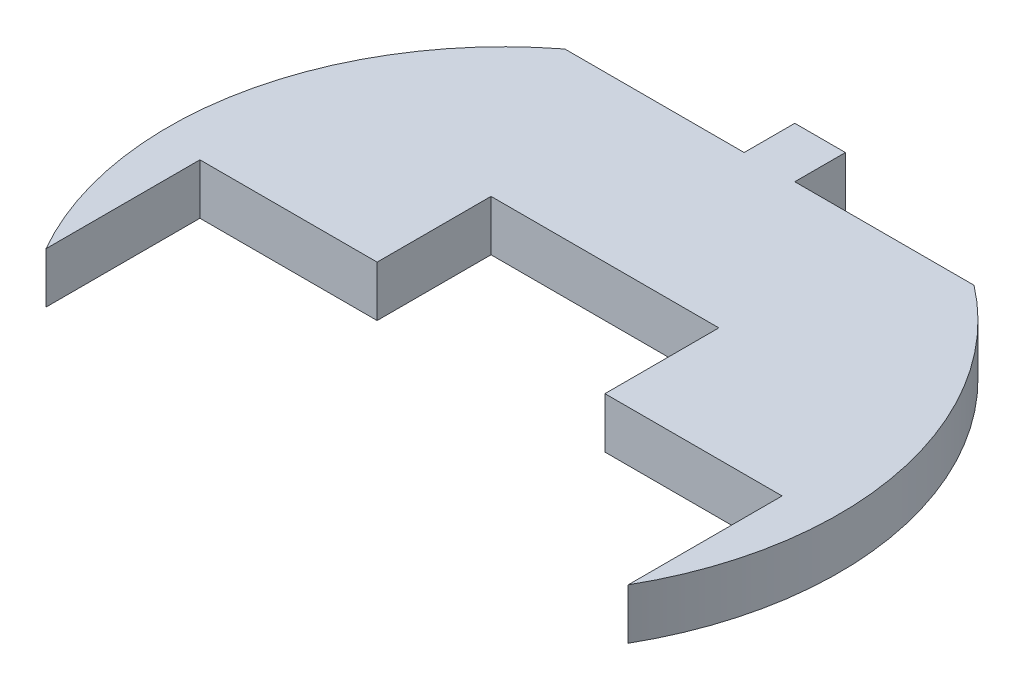
ISO-10303-21;
HEADER;
FILE_DESCRIPTION(('STEP AP214'),'2;1');
FILE_NAME('part.step','',(''),(''),'','','');
FILE_SCHEMA(('AUTOMOTIVE_DESIGN { 1 0 10303 214 1 1 1 1 }'));
ENDSEC;
DATA;
#1=APPLICATION_CONTEXT('core data for automotive mechanical design processes');
#2=APPLICATION_PROTOCOL_DEFINITION('international standard','automotive_design',2000,#1);
#3=PRODUCT_CONTEXT('',#1,'mechanical');
#4=PRODUCT('Part','Part','',(#3));
#5=PRODUCT_RELATED_PRODUCT_CATEGORY('part','',(#4));
#6=PRODUCT_DEFINITION_FORMATION('','',#4);
#7=PRODUCT_DEFINITION_CONTEXT('part definition',#1,'design');
#8=PRODUCT_DEFINITION('design','',#6,#7);
#9=PRODUCT_DEFINITION_SHAPE('','',#8);
#10=(LENGTH_UNIT() NAMED_UNIT(*) SI_UNIT(.MILLI.,.METRE.));
#11=(NAMED_UNIT(*) PLANE_ANGLE_UNIT() SI_UNIT($,.RADIAN.));
#12=(NAMED_UNIT(*) SI_UNIT($,.STERADIAN.) SOLID_ANGLE_UNIT());
#13=UNCERTAINTY_MEASURE_WITH_UNIT(LENGTH_MEASURE(1.E-05),#10,'distance_accuracy_value','');
#14=(GEOMETRIC_REPRESENTATION_CONTEXT(3) GLOBAL_UNCERTAINTY_ASSIGNED_CONTEXT((#13)) GLOBAL_UNIT_ASSIGNED_CONTEXT((#10,
#11,#12)) REPRESENTATION_CONTEXT('',''));
#15=CARTESIAN_POINT('',(0.,0.,0.));
#16=DIRECTION('',(0.,0.,1.));
#17=DIRECTION('',(1.,0.,0.));
#18=AXIS2_PLACEMENT_3D('',#15,#16,#17);
#19=CARTESIAN_POINT('',(0.,4.,5.));
#20=DIRECTION('',(0.,-1.,0.));
#21=DIRECTION('',(0.,0.,-1.));
#22=AXIS2_PLACEMENT_3D('',#19,#20,#21);
#23=CYLINDRICAL_SURFACE('',#22,26.5);
#24=CARTESIAN_POINT('',(0.,0.,5.));
#25=DIRECTION('',(0.,1.,0.));
#26=DIRECTION('',(0.,0.,1.));
#27=AXIS2_PLACEMENT_3D('',#24,#25,#26);
#28=CIRCLE('',#27,26.5);
#29=CARTESIAN_POINT('',(-23.,0.,18.1624465810882));
#30=VERTEX_POINT('',#29);
#31=CARTESIAN_POINT('',(-16.1632298752446,0.,-16.));
#32=VERTEX_POINT('',#31);
#33=EDGE_CURVE('E166',#30,#32,#28,.F.);
#34=ORIENTED_EDGE('',*,*,#33,.F.);
#35=DIRECTION('',(0.,-1.,0.));
#36=VECTOR('',#35,1.);
#37=CARTESIAN_POINT('',(-23.,4.,18.1624465810882));
#38=LINE('',#37,#36);
#39=CARTESIAN_POINT('',(-23.,4.,18.1624465810882));
#40=VERTEX_POINT('',#39);
#41=EDGE_CURVE('E11',#40,#30,#38,.T.);
#42=ORIENTED_EDGE('',*,*,#41,.F.);
#43=CARTESIAN_POINT('',(0.,4.,5.));
#44=DIRECTION('',(0.,1.,0.));
#45=DIRECTION('',(0.,0.,1.));
#46=AXIS2_PLACEMENT_3D('',#43,#44,#45);
#47=CIRCLE('',#46,26.5);
#48=CARTESIAN_POINT('',(-16.1632298752446,4.,-16.));
#49=VERTEX_POINT('',#48);
#50=EDGE_CURVE('E259',#40,#49,#47,.F.);
#51=ORIENTED_EDGE('',*,*,#50,.T.);
#52=DIRECTION('',(0.,-1.,0.));
#53=VECTOR('',#52,1.);
#54=CARTESIAN_POINT('',(-16.1632298752446,4.,-16.));
#55=LINE('',#54,#53);
#56=EDGE_CURVE('E51',#49,#32,#55,.T.);
#57=ORIENTED_EDGE('',*,*,#56,.T.);
#58=EDGE_LOOP('',(#34,#42,#51,#57));
#59=FACE_BOUND('',#58,.T.);
#60=ADVANCED_FACE('F34',(#59),#23,.T.);
#61=CARTESIAN_POINT('',(-23.,4.,0.));
#62=DIRECTION('',(-1.,0.,0.));
#63=DIRECTION('',(0.,0.,1.));
#64=AXIS2_PLACEMENT_3D('',#61,#62,#63);
#65=PLANE('',#64);
#66=DIRECTION('',(0.,0.,-1.));
#67=VECTOR('',#66,1.);
#68=CARTESIAN_POINT('',(-23.,0.,0.));
#69=LINE('',#68,#67);
#70=CARTESIAN_POINT('',(-23.,0.,6.));
#71=VERTEX_POINT('',#70);
#72=EDGE_CURVE('E168',#30,#71,#69,.T.);
#73=ORIENTED_EDGE('',*,*,#72,.T.);
#74=DIRECTION('',(0.,-1.,0.));
#75=VECTOR('',#74,1.);
#76=CARTESIAN_POINT('',(-23.,4.,6.));
#77=LINE('',#76,#75);
#78=CARTESIAN_POINT('',(-23.,4.,6.));
#79=VERTEX_POINT('',#78);
#80=EDGE_CURVE('E43',#79,#71,#77,.T.);
#81=ORIENTED_EDGE('',*,*,#80,.F.);
#82=DIRECTION('',(0.,0.,-1.));
#83=VECTOR('',#82,1.);
#84=CARTESIAN_POINT('',(-23.,4.,0.));
#85=LINE('',#84,#83);
#86=EDGE_CURVE('E260',#40,#79,#85,.T.);
#87=ORIENTED_EDGE('',*,*,#86,.F.);
#88=ORIENTED_EDGE('',*,*,#41,.T.);
#89=EDGE_LOOP('',(#73,#81,#87,#88));
#90=FACE_BOUND('',#89,.T.);
#91=ADVANCED_FACE('F36',(#90),#65,.F.);
#92=CARTESIAN_POINT('',(0.,4.,6.));
#93=DIRECTION('',(0.,0.,-1.));
#94=DIRECTION('',(-1.,0.,0.));
#95=AXIS2_PLACEMENT_3D('',#92,#93,#94);
#96=PLANE('',#95);
#97=DIRECTION('',(1.,0.,0.));
#98=VECTOR('',#97,1.);
#99=CARTESIAN_POINT('',(0.,0.,6.));
#100=LINE('',#99,#98);
#101=CARTESIAN_POINT('',(-9.,0.,6.));
#102=VERTEX_POINT('',#101);
#103=EDGE_CURVE('E171',#71,#102,#100,.T.);
#104=ORIENTED_EDGE('',*,*,#103,.T.);
#105=DIRECTION('',(0.,-1.,0.));
#106=VECTOR('',#105,1.);
#107=CARTESIAN_POINT('',(-9.,4.,6.));
#108=LINE('',#107,#106);
#109=CARTESIAN_POINT('',(-9.,4.,6.));
#110=VERTEX_POINT('',#109);
#111=EDGE_CURVE('E215',#110,#102,#108,.T.);
#112=ORIENTED_EDGE('',*,*,#111,.F.);
#113=DIRECTION('',(1.,0.,0.));
#114=VECTOR('',#113,1.);
#115=CARTESIAN_POINT('',(0.,4.,6.));
#116=LINE('',#115,#114);
#117=EDGE_CURVE('E224',#79,#110,#116,.T.);
#118=ORIENTED_EDGE('',*,*,#117,.F.);
#119=ORIENTED_EDGE('',*,*,#80,.T.);
#120=EDGE_LOOP('',(#104,#112,#118,#119));
#121=FACE_BOUND('',#120,.T.);
#122=ADVANCED_FACE('F222',(#121),#96,.F.);
#123=CARTESIAN_POINT('',(-9.,4.,0.));
#124=DIRECTION('',(-1.,0.,0.));
#125=DIRECTION('',(0.,0.,1.));
#126=AXIS2_PLACEMENT_3D('',#123,#124,#125);
#127=PLANE('',#126);
#128=DIRECTION('',(0.,0.,-1.));
#129=VECTOR('',#128,1.);
#130=CARTESIAN_POINT('',(-9.,0.,0.));
#131=LINE('',#130,#129);
#132=CARTESIAN_POINT('',(-9.,0.,-3.));
#133=VERTEX_POINT('',#132);
#134=EDGE_CURVE('E173',#102,#133,#131,.T.);
#135=ORIENTED_EDGE('',*,*,#134,.T.);
#136=DIRECTION('',(0.,-1.,0.));
#137=VECTOR('',#136,1.);
#138=CARTESIAN_POINT('',(-9.,4.,-3.));
#139=LINE('',#138,#137);
#140=CARTESIAN_POINT('',(-9.,4.,-3.));
#141=VERTEX_POINT('',#140);
#142=EDGE_CURVE('E212',#141,#133,#139,.T.);
#143=ORIENTED_EDGE('',*,*,#142,.F.);
#144=DIRECTION('',(0.,0.,-1.));
#145=VECTOR('',#144,1.);
#146=CARTESIAN_POINT('',(-9.,4.,0.));
#147=LINE('',#146,#145);
#148=EDGE_CURVE('E243',#110,#141,#147,.T.);
#149=ORIENTED_EDGE('',*,*,#148,.F.);
#150=ORIENTED_EDGE('',*,*,#111,.T.);
#151=EDGE_LOOP('',(#135,#143,#149,#150));
#152=FACE_BOUND('',#151,.T.);
#153=ADVANCED_FACE('F234',(#152),#127,.F.);
#154=CARTESIAN_POINT('',(0.,4.,-3.));
#155=DIRECTION('',(0.,0.,-1.));
#156=DIRECTION('',(-1.,0.,0.));
#157=AXIS2_PLACEMENT_3D('',#154,#155,#156);
#158=PLANE('',#157);
#159=DIRECTION('',(1.,0.,0.));
#160=VECTOR('',#159,1.);
#161=CARTESIAN_POINT('',(0.,0.,-3.));
#162=LINE('',#161,#160);
#163=CARTESIAN_POINT('',(9.,0.,-3.));
#164=VERTEX_POINT('',#163);
#165=EDGE_CURVE('E175',#133,#164,#162,.T.);
#166=ORIENTED_EDGE('',*,*,#165,.T.);
#167=DIRECTION('',(0.,-1.,0.));
#168=VECTOR('',#167,1.);
#169=CARTESIAN_POINT('',(9.,4.,-3.));
#170=LINE('',#169,#168);
#171=CARTESIAN_POINT('',(9.,4.,-3.));
#172=VERTEX_POINT('',#171);
#173=EDGE_CURVE('E209',#172,#164,#170,.T.);
#174=ORIENTED_EDGE('',*,*,#173,.F.);
#175=DIRECTION('',(1.,0.,0.));
#176=VECTOR('',#175,1.);
#177=CARTESIAN_POINT('',(0.,4.,-3.));
#178=LINE('',#177,#176);
#179=EDGE_CURVE('E240',#141,#172,#178,.T.);
#180=ORIENTED_EDGE('',*,*,#179,.F.);
#181=ORIENTED_EDGE('',*,*,#142,.T.);
#182=EDGE_LOOP('',(#166,#174,#180,#181));
#183=FACE_BOUND('',#182,.T.);
#184=ADVANCED_FACE('F238',(#183),#158,.F.);
#185=CARTESIAN_POINT('',(9.,4.,0.));
#186=DIRECTION('',(1.,0.,0.));
#187=DIRECTION('',(0.,0.,-1.));
#188=AXIS2_PLACEMENT_3D('',#185,#186,#187);
#189=PLANE('',#188);
#190=DIRECTION('',(0.,0.,1.));
#191=VECTOR('',#190,1.);
#192=CARTESIAN_POINT('',(9.,0.,0.));
#193=LINE('',#192,#191);
#194=CARTESIAN_POINT('',(9.,0.,6.));
#195=VERTEX_POINT('',#194);
#196=EDGE_CURVE('E177',#164,#195,#193,.T.);
#197=ORIENTED_EDGE('',*,*,#196,.T.);
#198=DIRECTION('',(0.,-1.,0.));
#199=VECTOR('',#198,1.);
#200=CARTESIAN_POINT('',(9.,4.,6.));
#201=LINE('',#200,#199);
#202=CARTESIAN_POINT('',(9.,4.,6.));
#203=VERTEX_POINT('',#202);
#204=EDGE_CURVE('E206',#203,#195,#201,.T.);
#205=ORIENTED_EDGE('',*,*,#204,.F.);
#206=DIRECTION('',(0.,0.,1.));
#207=VECTOR('',#206,1.);
#208=CARTESIAN_POINT('',(9.,4.,0.));
#209=LINE('',#208,#207);
#210=EDGE_CURVE('E242',#172,#203,#209,.T.);
#211=ORIENTED_EDGE('',*,*,#210,.F.);
#212=ORIENTED_EDGE('',*,*,#173,.T.);
#213=EDGE_LOOP('',(#197,#205,#211,#212));
#214=FACE_BOUND('',#213,.T.);
#215=ADVANCED_FACE('F283',(#214),#189,.F.);
#216=CARTESIAN_POINT('',(0.,4.,6.));
#217=DIRECTION('',(0.,0.,-1.));
#218=DIRECTION('',(-1.,0.,0.));
#219=AXIS2_PLACEMENT_3D('',#216,#217,#218);
#220=PLANE('',#219);
#221=DIRECTION('',(1.,0.,0.));
#222=VECTOR('',#221,1.);
#223=CARTESIAN_POINT('',(0.,0.,6.));
#224=LINE('',#223,#222);
#225=CARTESIAN_POINT('',(23.,0.,6.));
#226=VERTEX_POINT('',#225);
#227=EDGE_CURVE('E179',#195,#226,#224,.T.);
#228=ORIENTED_EDGE('',*,*,#227,.T.);
#229=DIRECTION('',(0.,-1.,0.));
#230=VECTOR('',#229,1.);
#231=CARTESIAN_POINT('',(23.,4.,6.));
#232=LINE('',#231,#230);
#233=CARTESIAN_POINT('',(23.,4.,6.));
#234=VERTEX_POINT('',#233);
#235=EDGE_CURVE('E203',#234,#226,#232,.T.);
#236=ORIENTED_EDGE('',*,*,#235,.F.);
#237=DIRECTION('',(1.,0.,0.));
#238=VECTOR('',#237,1.);
#239=CARTESIAN_POINT('',(0.,4.,6.));
#240=LINE('',#239,#238);
#241=EDGE_CURVE('E245',#203,#234,#240,.T.);
#242=ORIENTED_EDGE('',*,*,#241,.F.);
#243=ORIENTED_EDGE('',*,*,#204,.T.);
#244=EDGE_LOOP('',(#228,#236,#242,#243));
#245=FACE_BOUND('',#244,.T.);
#246=ADVANCED_FACE('F280',(#245),#220,.F.);
#247=CARTESIAN_POINT('',(23.,4.,0.));
#248=DIRECTION('',(1.,0.,0.));
#249=DIRECTION('',(0.,0.,-1.));
#250=AXIS2_PLACEMENT_3D('',#247,#248,#249);
#251=PLANE('',#250);
#252=DIRECTION('',(0.,0.,1.));
#253=VECTOR('',#252,1.);
#254=CARTESIAN_POINT('',(23.,0.,0.));
#255=LINE('',#254,#253);
#256=CARTESIAN_POINT('',(23.,0.,18.1624465810882));
#257=VERTEX_POINT('',#256);
#258=EDGE_CURVE('E181',#226,#257,#255,.T.);
#259=ORIENTED_EDGE('',*,*,#258,.T.);
#260=DIRECTION('',(0.,-1.,0.));
#261=VECTOR('',#260,1.);
#262=CARTESIAN_POINT('',(23.,4.,18.1624465810882));
#263=LINE('',#262,#261);
#264=CARTESIAN_POINT('',(23.,4.,18.1624465810882));
#265=VERTEX_POINT('',#264);
#266=EDGE_CURVE('E201',#265,#257,#263,.T.);
#267=ORIENTED_EDGE('',*,*,#266,.F.);
#268=DIRECTION('',(0.,0.,1.));
#269=VECTOR('',#268,1.);
#270=CARTESIAN_POINT('',(23.,4.,0.));
#271=LINE('',#270,#269);
#272=EDGE_CURVE('E251',#234,#265,#271,.T.);
#273=ORIENTED_EDGE('',*,*,#272,.F.);
#274=ORIENTED_EDGE('',*,*,#235,.T.);
#275=EDGE_LOOP('',(#259,#267,#273,#274));
#276=FACE_BOUND('',#275,.T.);
#277=ADVANCED_FACE('F276',(#276),#251,.F.);
#278=CARTESIAN_POINT('',(16.1632298752446,0.,-16.));
#279=VERTEX_POINT('',#278);
#280=EDGE_CURVE('E169',#279,#257,#28,.F.);
#281=ORIENTED_EDGE('',*,*,#280,.F.);
#282=DIRECTION('',(0.,-1.,0.));
#283=VECTOR('',#282,1.);
#284=CARTESIAN_POINT('',(16.1632298752446,4.,-16.));
#285=LINE('',#284,#283);
#286=CARTESIAN_POINT('',(16.1632298752446,4.,-16.));
#287=VERTEX_POINT('',#286);
#288=EDGE_CURVE('E199',#287,#279,#285,.T.);
#289=ORIENTED_EDGE('',*,*,#288,.F.);
#290=EDGE_CURVE('E252',#287,#265,#47,.F.);
#291=ORIENTED_EDGE('',*,*,#290,.T.);
#292=ORIENTED_EDGE('',*,*,#266,.T.);
#293=EDGE_LOOP('',(#281,#289,#291,#292));
#294=FACE_BOUND('',#293,.T.);
#295=ADVANCED_FACE('F267',(#294),#23,.T.);
#296=CARTESIAN_POINT('',(0.,4.,-16.));
#297=DIRECTION('',(0.,0.,-1.));
#298=DIRECTION('',(-1.,0.,0.));
#299=AXIS2_PLACEMENT_3D('',#296,#297,#298);
#300=PLANE('',#299);
#301=DIRECTION('',(1.,0.,0.));
#302=VECTOR('',#301,1.);
#303=CARTESIAN_POINT('',(0.,0.,-16.));
#304=LINE('',#303,#302);
#305=CARTESIAN_POINT('',(2.,0.,-16.));
#306=VERTEX_POINT('',#305);
#307=EDGE_CURVE('E184',#306,#279,#304,.T.);
#308=ORIENTED_EDGE('',*,*,#307,.F.);
#309=DIRECTION('',(0.,-1.,0.));
#310=VECTOR('',#309,1.);
#311=CARTESIAN_POINT('',(2.,4.,-16.));
#312=LINE('',#311,#310);
#313=CARTESIAN_POINT('',(2.,4.,-16.));
#314=VERTEX_POINT('',#313);
#315=EDGE_CURVE('E197',#314,#306,#312,.T.);
#316=ORIENTED_EDGE('',*,*,#315,.F.);
#317=DIRECTION('',(1.,0.,0.));
#318=VECTOR('',#317,1.);
#319=CARTESIAN_POINT('',(0.,4.,-16.));
#320=LINE('',#319,#318);
#321=EDGE_CURVE('E163',#314,#287,#320,.T.);
#322=ORIENTED_EDGE('',*,*,#321,.T.);
#323=ORIENTED_EDGE('',*,*,#288,.T.);
#324=EDGE_LOOP('',(#308,#316,#322,#323));
#325=FACE_BOUND('',#324,.T.);
#326=ADVANCED_FACE('F271',(#325),#300,.T.);
#327=CARTESIAN_POINT('',(1.99999999999963,4.,0.));
#328=DIRECTION('',(1.,0.,0.));
#329=DIRECTION('',(0.,0.,-1.));
#330=AXIS2_PLACEMENT_3D('',#327,#328,#329);
#331=PLANE('',#330);
#332=DIRECTION('',(0.,0.,1.));
#333=VECTOR('',#332,1.);
#334=CARTESIAN_POINT('',(1.99999999999963,0.,0.));
#335=LINE('',#334,#333);
#336=CARTESIAN_POINT('',(2.00000000000004,0.,-20.));
#337=VERTEX_POINT('',#336);
#338=EDGE_CURVE('E187',#337,#306,#335,.T.);
#339=ORIENTED_EDGE('',*,*,#338,.F.);
#340=DIRECTION('',(0.,-1.,0.));
#341=VECTOR('',#340,1.);
#342=CARTESIAN_POINT('',(2.00000000000004,4.,-20.));
#343=LINE('',#342,#341);
#344=CARTESIAN_POINT('',(2.00000000000004,4.,-20.));
#345=VERTEX_POINT('',#344);
#346=EDGE_CURVE('E146',#345,#337,#343,.T.);
#347=ORIENTED_EDGE('',*,*,#346,.F.);
#348=DIRECTION('',(0.,0.,1.));
#349=VECTOR('',#348,1.);
#350=CARTESIAN_POINT('',(1.99999999999963,4.,0.));
#351=LINE('',#350,#349);
#352=EDGE_CURVE('E157',#345,#314,#351,.T.);
#353=ORIENTED_EDGE('',*,*,#352,.T.);
#354=ORIENTED_EDGE('',*,*,#315,.T.);
#355=EDGE_LOOP('',(#339,#347,#353,#354));
#356=FACE_BOUND('',#355,.T.);
#357=ADVANCED_FACE('F256',(#356),#331,.T.);
#358=CARTESIAN_POINT('',(0.,4.,-20.));
#359=DIRECTION('',(0.,0.,-1.));
#360=DIRECTION('',(-1.,0.,0.));
#361=AXIS2_PLACEMENT_3D('',#358,#359,#360);
#362=PLANE('',#361);
#363=DIRECTION('',(1.,0.,0.));
#364=VECTOR('',#363,1.);
#365=CARTESIAN_POINT('',(0.,0.,-20.));
#366=LINE('',#365,#364);
#367=CARTESIAN_POINT('',(-1.99999999999996,0.,-20.));
#368=VERTEX_POINT('',#367);
#369=EDGE_CURVE('E142',#368,#337,#366,.T.);
#370=ORIENTED_EDGE('',*,*,#369,.F.);
#371=DIRECTION('',(0.,-1.,0.));
#372=VECTOR('',#371,1.);
#373=CARTESIAN_POINT('',(-1.99999999999996,4.,-20.));
#374=LINE('',#373,#372);
#375=CARTESIAN_POINT('',(-1.99999999999996,4.,-20.));
#376=VERTEX_POINT('',#375);
#377=EDGE_CURVE('E137',#376,#368,#374,.T.);
#378=ORIENTED_EDGE('',*,*,#377,.F.);
#379=DIRECTION('',(1.,0.,0.));
#380=VECTOR('',#379,1.);
#381=CARTESIAN_POINT('',(0.,4.,-20.));
#382=LINE('',#381,#380);
#383=EDGE_CURVE('E140',#376,#345,#382,.T.);
#384=ORIENTED_EDGE('',*,*,#383,.T.);
#385=ORIENTED_EDGE('',*,*,#346,.T.);
#386=EDGE_LOOP('',(#370,#378,#384,#385));
#387=FACE_BOUND('',#386,.T.);
#388=ADVANCED_FACE('F139',(#387),#362,.T.);
#389=CARTESIAN_POINT('',(-1.99999999999996,4.,0.));
#390=DIRECTION('',(-1.,0.,0.));
#391=DIRECTION('',(0.,0.,1.));
#392=AXIS2_PLACEMENT_3D('',#389,#390,#391);
#393=PLANE('',#392);
#394=DIRECTION('',(0.,0.,-1.));
#395=VECTOR('',#394,1.);
#396=CARTESIAN_POINT('',(-1.99999999999996,0.,0.));
#397=LINE('',#396,#395);
#398=CARTESIAN_POINT('',(-1.99999999999996,0.,-16.));
#399=VERTEX_POINT('',#398);
#400=EDGE_CURVE('E192',#399,#368,#397,.T.);
#401=ORIENTED_EDGE('',*,*,#400,.F.);
#402=DIRECTION('',(0.,-1.,0.));
#403=VECTOR('',#402,1.);
#404=CARTESIAN_POINT('',(-1.99999999999996,4.,-16.));
#405=LINE('',#404,#403);
#406=CARTESIAN_POINT('',(-1.99999999999996,4.,-16.));
#407=VERTEX_POINT('',#406);
#408=EDGE_CURVE('E94',#407,#399,#405,.T.);
#409=ORIENTED_EDGE('',*,*,#408,.F.);
#410=DIRECTION('',(0.,0.,-1.));
#411=VECTOR('',#410,1.);
#412=CARTESIAN_POINT('',(-1.99999999999996,4.,0.));
#413=LINE('',#412,#411);
#414=EDGE_CURVE('E154',#407,#376,#413,.T.);
#415=ORIENTED_EDGE('',*,*,#414,.T.);
#416=ORIENTED_EDGE('',*,*,#377,.T.);
#417=EDGE_LOOP('',(#401,#409,#415,#416));
#418=FACE_BOUND('',#417,.T.);
#419=ADVANCED_FACE('F159',(#418),#393,.T.);
#420=EDGE_CURVE('E188',#32,#399,#304,.T.);
#421=ORIENTED_EDGE('',*,*,#420,.F.);
#422=ORIENTED_EDGE('',*,*,#56,.F.);
#423=EDGE_CURVE('E160',#49,#407,#320,.T.);
#424=ORIENTED_EDGE('',*,*,#423,.T.);
#425=ORIENTED_EDGE('',*,*,#408,.T.);
#426=EDGE_LOOP('',(#421,#422,#424,#425));
#427=FACE_BOUND('',#426,.T.);
#428=ADVANCED_FACE('F305',(#427),#300,.T.);
#429=CARTESIAN_POINT('',(0.,4.,0.));
#430=DIRECTION('',(0.,1.,0.));
#431=DIRECTION('',(0.,0.,1.));
#432=AXIS2_PLACEMENT_3D('',#429,#430,#431);
#433=PLANE('',#432);
#434=ORIENTED_EDGE('',*,*,#50,.F.);
#435=ORIENTED_EDGE('',*,*,#86,.T.);
#436=ORIENTED_EDGE('',*,*,#117,.T.);
#437=ORIENTED_EDGE('',*,*,#148,.T.);
#438=ORIENTED_EDGE('',*,*,#179,.T.);
#439=ORIENTED_EDGE('',*,*,#210,.T.);
#440=ORIENTED_EDGE('',*,*,#241,.T.);
#441=ORIENTED_EDGE('',*,*,#272,.T.);
#442=ORIENTED_EDGE('',*,*,#290,.F.);
#443=ORIENTED_EDGE('',*,*,#321,.F.);
#444=ORIENTED_EDGE('',*,*,#352,.F.);
#445=ORIENTED_EDGE('',*,*,#383,.F.);
#446=ORIENTED_EDGE('',*,*,#414,.F.);
#447=ORIENTED_EDGE('',*,*,#423,.F.);
#448=EDGE_LOOP('',(#434,#435,#436,#437,#438,#439,#440,#441,#442,#443,#444,#445,#446,#447));
#449=FACE_BOUND('',#448,.T.);
#450=ADVANCED_FACE('F152',(#449),#433,.T.);
#451=CARTESIAN_POINT('',(0.,0.,0.));
#452=DIRECTION('',(0.,1.,0.));
#453=DIRECTION('',(0.,0.,1.));
#454=AXIS2_PLACEMENT_3D('',#451,#452,#453);
#455=PLANE('',#454);
#456=ORIENTED_EDGE('',*,*,#33,.T.);
#457=ORIENTED_EDGE('',*,*,#420,.T.);
#458=ORIENTED_EDGE('',*,*,#400,.T.);
#459=ORIENTED_EDGE('',*,*,#369,.T.);
#460=ORIENTED_EDGE('',*,*,#338,.T.);
#461=ORIENTED_EDGE('',*,*,#307,.T.);
#462=ORIENTED_EDGE('',*,*,#280,.T.);
#463=ORIENTED_EDGE('',*,*,#258,.F.);
#464=ORIENTED_EDGE('',*,*,#227,.F.);
#465=ORIENTED_EDGE('',*,*,#196,.F.);
#466=ORIENTED_EDGE('',*,*,#165,.F.);
#467=ORIENTED_EDGE('',*,*,#134,.F.);
#468=ORIENTED_EDGE('',*,*,#103,.F.);
#469=ORIENTED_EDGE('',*,*,#72,.F.);
#470=EDGE_LOOP('',(#456,#457,#458,#459,#460,#461,#462,#463,#464,#465,#466,#467,#468,#469));
#471=FACE_BOUND('',#470,.T.);
#472=ADVANCED_FACE('F229',(#471),#455,.F.);
#473=CLOSED_SHELL('',(#60,#91,#122,#153,#184,#215,#246,#277,#295,#326,#357,#388,#419,#428,#450,#472));
#474=MANIFOLD_SOLID_BREP('B2',#473);
#475=ADVANCED_BREP_SHAPE_REPRESENTATION('',(#18,#474),#14);
#476=SHAPE_DEFINITION_REPRESENTATION(#9,#475);
ENDSEC;
END-ISO-10303-21;
